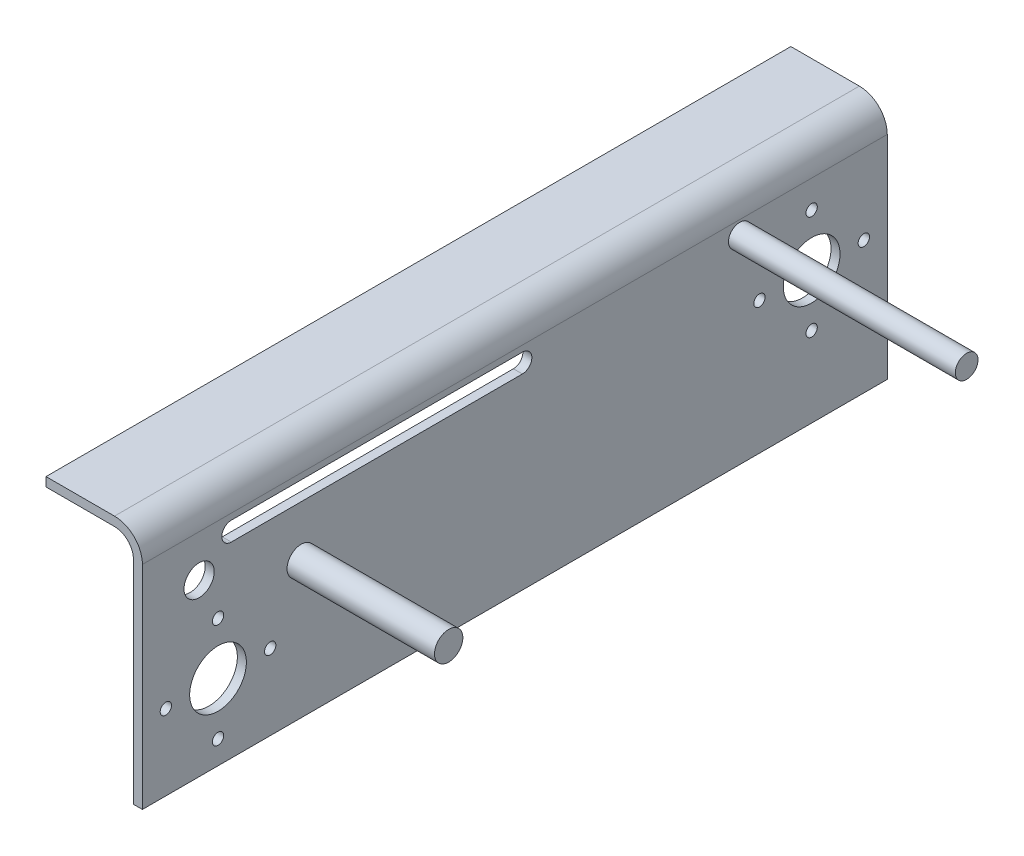
ISO-10303-21;
HEADER;
FILE_DESCRIPTION(('STEP AP214'),'2;1');
FILE_NAME('part.step','',(''),(''),'','','');
FILE_SCHEMA(('AUTOMOTIVE_DESIGN { 1 0 10303 214 1 1 1 1 }'));
ENDSEC;
DATA;
#1=APPLICATION_CONTEXT('core data for automotive mechanical design processes');
#2=APPLICATION_PROTOCOL_DEFINITION('international standard','automotive_design',2000,#1);
#3=PRODUCT_CONTEXT('',#1,'mechanical');
#4=PRODUCT('Part','Part','',(#3));
#5=PRODUCT_RELATED_PRODUCT_CATEGORY('part','',(#4));
#6=PRODUCT_DEFINITION_FORMATION('','',#4);
#7=PRODUCT_DEFINITION_CONTEXT('part definition',#1,'design');
#8=PRODUCT_DEFINITION('design','',#6,#7);
#9=PRODUCT_DEFINITION_SHAPE('','',#8);
#10=(LENGTH_UNIT() NAMED_UNIT(*) SI_UNIT(.MILLI.,.METRE.));
#11=(NAMED_UNIT(*) PLANE_ANGLE_UNIT() SI_UNIT($,.RADIAN.));
#12=(NAMED_UNIT(*) SI_UNIT($,.STERADIAN.) SOLID_ANGLE_UNIT());
#13=UNCERTAINTY_MEASURE_WITH_UNIT(LENGTH_MEASURE(1.E-05),#10,'distance_accuracy_value','');
#14=(GEOMETRIC_REPRESENTATION_CONTEXT(3) GLOBAL_UNCERTAINTY_ASSIGNED_CONTEXT((#13)) GLOBAL_UNIT_ASSIGNED_CONTEXT((#10,
#11,#12)) REPRESENTATION_CONTEXT('',''));
#15=CARTESIAN_POINT('',(0.,0.,0.));
#16=DIRECTION('',(0.,0.,1.));
#17=DIRECTION('',(1.,0.,0.));
#18=AXIS2_PLACEMENT_3D('',#15,#16,#17);
#19=CARTESIAN_POINT('',(96.1646609388252,24.5714715738549,-394.));
#20=DIRECTION('',(-1.,0.,0.));
#21=DIRECTION('',(0.,0.,1.));
#22=AXIS2_PLACEMENT_3D('',#19,#20,#21);
#23=PLANE('',#22);
#24=CARTESIAN_POINT('',(96.1646609388252,128.571471573855,-47.));
#25=DIRECTION('',(-1.,0.,0.));
#26=DIRECTION('',(0.,0.,1.));
#27=AXIS2_PLACEMENT_3D('',#24,#25,#26);
#28=CIRCLE('',#27,5.00000000000003);
#29=CARTESIAN_POINT('',(96.1646609388252,123.571471573855,-47.));
#30=VERTEX_POINT('',#29);
#31=CARTESIAN_POINT('',(96.1646609388252,133.571471573855,-47.));
#32=VERTEX_POINT('',#31);
#33=EDGE_CURVE('E161',#30,#32,#28,.T.);
#34=ORIENTED_EDGE('',*,*,#33,.F.);
#35=DIRECTION('',(0.,0.,1.));
#36=VECTOR('',#35,1.);
#37=CARTESIAN_POINT('',(96.1646609388252,123.571471573855,-394.));
#38=LINE('',#37,#36);
#39=CARTESIAN_POINT('',(96.1646609388252,123.571471573855,-201.));
#40=VERTEX_POINT('',#39);
#41=EDGE_CURVE('E154',#40,#30,#38,.T.);
#42=ORIENTED_EDGE('',*,*,#41,.F.);
#43=CARTESIAN_POINT('',(96.1646609388252,128.571471573855,-201.));
#44=DIRECTION('',(-1.,0.,0.));
#45=DIRECTION('',(0.,0.,1.));
#46=AXIS2_PLACEMENT_3D('',#43,#44,#45);
#47=CIRCLE('',#46,5.00000000000003);
#48=CARTESIAN_POINT('',(96.1646609388252,133.571471573855,-201.));
#49=VERTEX_POINT('',#48);
#50=EDGE_CURVE('E134',#49,#40,#47,.T.);
#51=ORIENTED_EDGE('',*,*,#50,.F.);
#52=DIRECTION('',(0.,0.,-1.));
#53=VECTOR('',#52,1.);
#54=CARTESIAN_POINT('',(96.1646609388252,133.571471573855,-394.));
#55=LINE('',#54,#53);
#56=EDGE_CURVE('E159',#32,#49,#55,.T.);
#57=ORIENTED_EDGE('',*,*,#56,.F.);
#58=EDGE_LOOP('',(#34,#42,#51,#57));
#59=FACE_BOUND('',#58,.T.);
#60=CARTESIAN_POINT('',(96.1646609388252,114.571471573855,-30.));
#61=DIRECTION('',(-1.,0.,0.));
#62=DIRECTION('',(0.,0.,1.));
#63=AXIS2_PLACEMENT_3D('',#60,#61,#62);
#64=CIRCLE('',#63,8.);
#65=CARTESIAN_POINT('',(96.1646609388252,114.571471573855,-22.));
#66=VERTEX_POINT('',#65);
#67=EDGE_CURVE('E178',#66,#66,#64,.T.);
#68=ORIENTED_EDGE('',*,*,#67,.F.);
#69=EDGE_LOOP('',(#68));
#70=FACE_BOUND('',#69,.T.);
#71=CARTESIAN_POINT('',(96.1646609388252,36.9738849847746,-40.0000000000078));
#72=DIRECTION('',(-1.,0.,0.));
#73=DIRECTION('',(0.,0.,-1.));
#74=AXIS2_PLACEMENT_3D('',#71,#72,#73);
#75=CIRCLE('',#74,3.00000000000782);
#76=CARTESIAN_POINT('',(96.1646609388252,36.9738849847746,-43.0000000000156));
#77=VERTEX_POINT('',#76);
#78=EDGE_CURVE('E186',#77,#77,#75,.T.);
#79=ORIENTED_EDGE('',*,*,#78,.F.);
#80=EDGE_LOOP('',(#79));
#81=FACE_BOUND('',#80,.T.);
#82=CARTESIAN_POINT('',(96.1646609388252,64.5714715738549,-40.));
#83=DIRECTION('',(-1.,0.,0.));
#84=DIRECTION('',(0.,0.,-1.));
#85=AXIS2_PLACEMENT_3D('',#82,#83,#84);
#86=CIRCLE('',#85,15.);
#87=CARTESIAN_POINT('',(96.1646609388252,64.5714715738549,-55.0000000000001));
#88=VERTEX_POINT('',#87);
#89=EDGE_CURVE('E200',#88,#88,#86,.T.);
#90=ORIENTED_EDGE('',*,*,#89,.F.);
#91=EDGE_LOOP('',(#90));
#92=FACE_BOUND('',#91,.T.);
#93=CARTESIAN_POINT('',(96.1646609388252,92.1690581629351,-40.));
#94=DIRECTION('',(-1.,0.,0.));
#95=DIRECTION('',(0.,0.,-1.));
#96=AXIS2_PLACEMENT_3D('',#93,#94,#95);
#97=CIRCLE('',#96,2.99999999999994);
#98=CARTESIAN_POINT('',(96.1646609388252,92.1690581629351,-43.));
#99=VERTEX_POINT('',#98);
#100=EDGE_CURVE('E194',#99,#99,#97,.T.);
#101=ORIENTED_EDGE('',*,*,#100,.F.);
#102=EDGE_LOOP('',(#101));
#103=FACE_BOUND('',#102,.T.);
#104=CARTESIAN_POINT('',(96.1646609388252,64.5714715738588,-67.5975865890841));
#105=DIRECTION('',(-1.,0.,0.));
#106=DIRECTION('',(0.,0.,-1.));
#107=AXIS2_PLACEMENT_3D('',#104,#105,#106);
#108=CIRCLE('',#107,3.00000000000261);
#109=CARTESIAN_POINT('',(96.1646609388252,64.5714715738588,-70.5975865890867));
#110=VERTEX_POINT('',#109);
#111=EDGE_CURVE('E193',#110,#110,#108,.T.);
#112=ORIENTED_EDGE('',*,*,#111,.F.);
#113=EDGE_LOOP('',(#112));
#114=FACE_BOUND('',#113,.T.);
#115=CARTESIAN_POINT('',(96.1646609388252,64.5714715738509,-12.4024134109237));
#116=DIRECTION('',(-1.,0.,0.));
#117=DIRECTION('',(0.,0.,-1.));
#118=AXIS2_PLACEMENT_3D('',#115,#116,#117);
#119=CIRCLE('',#118,3.00000000000516);
#120=CARTESIAN_POINT('',(96.1646609388252,64.5714715738509,-15.4024134109289));
#121=VERTEX_POINT('',#120);
#122=EDGE_CURVE('E206',#121,#121,#119,.T.);
#123=ORIENTED_EDGE('',*,*,#122,.F.);
#124=EDGE_LOOP('',(#123));
#125=FACE_BOUND('',#124,.T.);
#126=CARTESIAN_POINT('',(96.1646609388252,94.5714715738588,-381.597586589085));
#127=DIRECTION('',(-1.,0.,0.));
#128=DIRECTION('',(0.,0.,-1.));
#129=AXIS2_PLACEMENT_3D('',#126,#127,#128);
#130=CIRCLE('',#129,3.00000000000249);
#131=CARTESIAN_POINT('',(96.1646609388252,94.5714715738588,-384.597586589087));
#132=VERTEX_POINT('',#131);
#133=EDGE_CURVE('E224',#132,#132,#130,.T.);
#134=ORIENTED_EDGE('',*,*,#133,.F.);
#135=EDGE_LOOP('',(#134));
#136=FACE_BOUND('',#135,.T.);
#137=CARTESIAN_POINT('',(96.1646609388252,94.5714715738549,-354.));
#138=DIRECTION('',(-1.,0.,0.));
#139=DIRECTION('',(0.,0.,-1.));
#140=AXIS2_PLACEMENT_3D('',#137,#138,#139);
#141=CIRCLE('',#140,15.0000000000001);
#142=CARTESIAN_POINT('',(96.1646609388252,94.5714715738549,-369.));
#143=VERTEX_POINT('',#142);
#144=EDGE_CURVE('E218',#143,#143,#141,.T.);
#145=ORIENTED_EDGE('',*,*,#144,.F.);
#146=EDGE_LOOP('',(#145));
#147=FACE_BOUND('',#146,.T.);
#148=CARTESIAN_POINT('',(96.1646609388252,66.9738849847746,-354.000000000008));
#149=DIRECTION('',(-1.,0.,0.));
#150=DIRECTION('',(0.,0.,-1.));
#151=AXIS2_PLACEMENT_3D('',#148,#149,#150);
#152=CIRCLE('',#151,3.00000000000783);
#153=CARTESIAN_POINT('',(96.1646609388252,66.9738849847746,-357.000000000016));
#154=VERTEX_POINT('',#153);
#155=EDGE_CURVE('E217',#154,#154,#152,.T.);
#156=ORIENTED_EDGE('',*,*,#155,.F.);
#157=EDGE_LOOP('',(#156));
#158=FACE_BOUND('',#157,.T.);
#159=CARTESIAN_POINT('',(96.1646609388252,94.571471573851,-326.402413410924));
#160=DIRECTION('',(-1.,0.,0.));
#161=DIRECTION('',(0.,0.,-1.));
#162=AXIS2_PLACEMENT_3D('',#159,#160,#161);
#163=CIRCLE('',#162,3.00000000000528);
#164=CARTESIAN_POINT('',(96.1646609388252,94.571471573851,-329.402413410929));
#165=VERTEX_POINT('',#164);
#166=EDGE_CURVE('E230',#165,#165,#163,.T.);
#167=ORIENTED_EDGE('',*,*,#166,.F.);
#168=EDGE_LOOP('',(#167));
#169=FACE_BOUND('',#168,.T.);
#170=CARTESIAN_POINT('',(96.1646609388252,122.169058162935,-354.));
#171=DIRECTION('',(-1.,0.,0.));
#172=DIRECTION('',(0.,0.,-1.));
#173=AXIS2_PLACEMENT_3D('',#170,#171,#172);
#174=CIRCLE('',#173,2.99999999999994);
#175=CARTESIAN_POINT('',(96.1646609388252,122.169058162935,-357.));
#176=VERTEX_POINT('',#175);
#177=EDGE_CURVE('E181',#176,#176,#174,.T.);
#178=ORIENTED_EDGE('',*,*,#177,.F.);
#179=EDGE_LOOP('',(#178));
#180=FACE_BOUND('',#179,.T.);
#181=DIRECTION('',(0.,-1.,0.));
#182=VECTOR('',#181,1.);
#183=CARTESIAN_POINT('',(96.1646609388252,24.5714715738549,0.));
#184=LINE('',#183,#182);
#185=CARTESIAN_POINT('',(96.1646609388252,136.808971573855,0.));
#186=VERTEX_POINT('',#185);
#187=CARTESIAN_POINT('',(96.1646609388252,24.5714715738549,0.));
#188=VERTEX_POINT('',#187);
#189=EDGE_CURVE('E185',#186,#188,#184,.T.);
#190=ORIENTED_EDGE('',*,*,#189,.F.);
#191=DIRECTION('',(0.,0.,1.));
#192=VECTOR('',#191,1.);
#193=CARTESIAN_POINT('',(96.1646609388252,136.808971573855,-394.));
#194=LINE('',#193,#192);
#195=CARTESIAN_POINT('',(96.1646609388252,136.808971573855,-394.));
#196=VERTEX_POINT('',#195);
#197=EDGE_CURVE('E11',#196,#186,#194,.T.);
#198=ORIENTED_EDGE('',*,*,#197,.F.);
#199=DIRECTION('',(0.,-1.,0.));
#200=VECTOR('',#199,1.);
#201=CARTESIAN_POINT('',(96.1646609388252,24.5714715738549,-394.));
#202=LINE('',#201,#200);
#203=CARTESIAN_POINT('',(96.1646609388252,24.5714715738549,-394.));
#204=VERTEX_POINT('',#203);
#205=EDGE_CURVE('E242',#196,#204,#202,.T.);
#206=ORIENTED_EDGE('',*,*,#205,.T.);
#207=DIRECTION('',(0.,0.,1.));
#208=VECTOR('',#207,1.);
#209=CARTESIAN_POINT('',(96.1646609388252,24.5714715738549,-394.));
#210=LINE('',#209,#208);
#211=EDGE_CURVE('E42',#204,#188,#210,.T.);
#212=ORIENTED_EDGE('',*,*,#211,.T.);
#213=EDGE_LOOP('',(#190,#198,#206,#212));
#214=FACE_BOUND('',#213,.T.);
#215=ADVANCED_FACE('F39',(#59,#70,#81,#92,#103,#114,#125,#136,#147,#158,#169,#180,#214),#23,.T.);
#216=CARTESIAN_POINT('',(86.1646609388252,136.808971573855,-394.));
#217=DIRECTION('',(0.,0.,1.));
#218=DIRECTION('',(1.,0.,0.));
#219=AXIS2_PLACEMENT_3D('',#216,#217,#218);
#220=CYLINDRICAL_SURFACE('',#219,9.99999999999999);
#221=CARTESIAN_POINT('',(86.1646609388252,136.808971573855,0.));
#222=DIRECTION('',(0.,0.,-1.));
#223=DIRECTION('',(-1.,0.,0.));
#224=AXIS2_PLACEMENT_3D('',#221,#222,#223);
#225=CIRCLE('',#224,9.99999999999999);
#226=CARTESIAN_POINT('',(86.1646609388253,146.808971573855,0.));
#227=VERTEX_POINT('',#226);
#228=EDGE_CURVE('E246',#227,#186,#225,.T.);
#229=ORIENTED_EDGE('',*,*,#228,.F.);
#230=DIRECTION('',(0.,0.,1.));
#231=VECTOR('',#230,1.);
#232=CARTESIAN_POINT('',(86.1646609388253,146.808971573855,-394.));
#233=LINE('',#232,#231);
#234=CARTESIAN_POINT('',(86.1646609388253,146.808971573855,-394.));
#235=VERTEX_POINT('',#234);
#236=EDGE_CURVE('E47',#235,#227,#233,.T.);
#237=ORIENTED_EDGE('',*,*,#236,.F.);
#238=CARTESIAN_POINT('',(86.1646609388252,136.808971573855,-394.));
#239=DIRECTION('',(0.,0.,-1.));
#240=DIRECTION('',(-1.,0.,0.));
#241=AXIS2_PLACEMENT_3D('',#238,#239,#240);
#242=CIRCLE('',#241,9.99999999999999);
#243=EDGE_CURVE('E264',#235,#196,#242,.T.);
#244=ORIENTED_EDGE('',*,*,#243,.T.);
#245=ORIENTED_EDGE('',*,*,#197,.T.);
#246=EDGE_LOOP('',(#229,#237,#244,#245));
#247=FACE_BOUND('',#246,.T.);
#248=ADVANCED_FACE('F311',(#247),#220,.F.);
#249=CARTESIAN_POINT('',(49.9271609388252,146.808971573855,-394.));
#250=DIRECTION('',(0.,-1.,0.));
#251=DIRECTION('',(1.,0.,0.));
#252=AXIS2_PLACEMENT_3D('',#249,#250,#251);
#253=PLANE('',#252);
#254=DIRECTION('',(1.,0.,0.));
#255=VECTOR('',#254,1.);
#256=CARTESIAN_POINT('',(49.9271609388252,146.808971573855,0.));
#257=LINE('',#256,#255);
#258=CARTESIAN_POINT('',(49.9271609388252,146.808971573855,0.));
#259=VERTEX_POINT('',#258);
#260=EDGE_CURVE('E284',#259,#227,#257,.T.);
#261=ORIENTED_EDGE('',*,*,#260,.F.);
#262=DIRECTION('',(0.,0.,1.));
#263=VECTOR('',#262,1.);
#264=CARTESIAN_POINT('',(49.9271609388252,146.808971573855,-394.));
#265=LINE('',#264,#263);
#266=CARTESIAN_POINT('',(49.9271609388252,146.808971573855,-394.));
#267=VERTEX_POINT('',#266);
#268=EDGE_CURVE('E290',#267,#259,#265,.T.);
#269=ORIENTED_EDGE('',*,*,#268,.F.);
#270=DIRECTION('',(1.,0.,0.));
#271=VECTOR('',#270,1.);
#272=CARTESIAN_POINT('',(49.9271609388252,146.808971573855,-394.));
#273=LINE('',#272,#271);
#274=EDGE_CURVE('E261',#267,#235,#273,.T.);
#275=ORIENTED_EDGE('',*,*,#274,.T.);
#276=ORIENTED_EDGE('',*,*,#236,.T.);
#277=EDGE_LOOP('',(#261,#269,#275,#276));
#278=FACE_BOUND('',#277,.T.);
#279=ADVANCED_FACE('F331',(#278),#253,.T.);
#280=CARTESIAN_POINT('',(49.9271609388252,146.808971573855,-394.));
#281=DIRECTION('',(-1.,0.,0.));
#282=DIRECTION('',(0.,-1.,0.));
#283=AXIS2_PLACEMENT_3D('',#280,#281,#282);
#284=PLANE('',#283);
#285=DIRECTION('',(0.,-1.,0.));
#286=VECTOR('',#285,1.);
#287=CARTESIAN_POINT('',(49.9271609388252,146.808971573855,0.));
#288=LINE('',#287,#286);
#289=CARTESIAN_POINT('',(49.9271609388252,151.571471573855,0.));
#290=VERTEX_POINT('',#289);
#291=EDGE_CURVE('E281',#290,#259,#288,.T.);
#292=ORIENTED_EDGE('',*,*,#291,.F.);
#293=DIRECTION('',(0.,0.,1.));
#294=VECTOR('',#293,1.);
#295=CARTESIAN_POINT('',(49.9271609388252,151.571471573855,-394.));
#296=LINE('',#295,#294);
#297=CARTESIAN_POINT('',(49.9271609388252,151.571471573855,-394.));
#298=VERTEX_POINT('',#297);
#299=EDGE_CURVE('E292',#298,#290,#296,.T.);
#300=ORIENTED_EDGE('',*,*,#299,.F.);
#301=DIRECTION('',(0.,-1.,0.));
#302=VECTOR('',#301,1.);
#303=CARTESIAN_POINT('',(49.9271609388252,146.808971573855,-394.));
#304=LINE('',#303,#302);
#305=EDGE_CURVE('E258',#298,#267,#304,.T.);
#306=ORIENTED_EDGE('',*,*,#305,.T.);
#307=ORIENTED_EDGE('',*,*,#268,.T.);
#308=EDGE_LOOP('',(#292,#300,#306,#307));
#309=FACE_BOUND('',#308,.T.);
#310=ADVANCED_FACE('F329',(#309),#284,.T.);
#311=CARTESIAN_POINT('',(49.9271609388252,151.571471573855,-394.));
#312=DIRECTION('',(0.,1.,0.));
#313=DIRECTION('',(-1.,0.,0.));
#314=AXIS2_PLACEMENT_3D('',#311,#312,#313);
#315=PLANE('',#314);
#316=DIRECTION('',(-1.,0.,0.));
#317=VECTOR('',#316,1.);
#318=CARTESIAN_POINT('',(49.9271609388252,151.571471573855,0.));
#319=LINE('',#318,#317);
#320=CARTESIAN_POINT('',(86.1646609388253,151.571471573855,0.));
#321=VERTEX_POINT('',#320);
#322=EDGE_CURVE('E278',#321,#290,#319,.T.);
#323=ORIENTED_EDGE('',*,*,#322,.F.);
#324=DIRECTION('',(0.,0.,1.));
#325=VECTOR('',#324,1.);
#326=CARTESIAN_POINT('',(86.1646609388253,151.571471573855,-394.));
#327=LINE('',#326,#325);
#328=CARTESIAN_POINT('',(86.1646609388253,151.571471573855,-394.));
#329=VERTEX_POINT('',#328);
#330=EDGE_CURVE('E294',#329,#321,#327,.T.);
#331=ORIENTED_EDGE('',*,*,#330,.F.);
#332=DIRECTION('',(-1.,0.,0.));
#333=VECTOR('',#332,1.);
#334=CARTESIAN_POINT('',(49.9271609388252,151.571471573855,-394.));
#335=LINE('',#334,#333);
#336=EDGE_CURVE('E255',#329,#298,#335,.T.);
#337=ORIENTED_EDGE('',*,*,#336,.T.);
#338=ORIENTED_EDGE('',*,*,#299,.T.);
#339=EDGE_LOOP('',(#323,#331,#337,#338));
#340=FACE_BOUND('',#339,.T.);
#341=ADVANCED_FACE('F325',(#340),#315,.T.);
#342=CARTESIAN_POINT('',(86.1646609388252,136.808971573855,-394.));
#343=DIRECTION('',(0.,0.,1.));
#344=DIRECTION('',(1.,0.,0.));
#345=AXIS2_PLACEMENT_3D('',#342,#343,#344);
#346=CYLINDRICAL_SURFACE('',#345,14.7625);
#347=CARTESIAN_POINT('',(86.1646609388252,136.808971573855,0.));
#348=DIRECTION('',(0.,0.,1.));
#349=DIRECTION('',(-1.,0.,0.));
#350=AXIS2_PLACEMENT_3D('',#347,#348,#349);
#351=CIRCLE('',#350,14.7625);
#352=CARTESIAN_POINT('',(100.927160938825,136.808971573855,0.));
#353=VERTEX_POINT('',#352);
#354=EDGE_CURVE('E275',#353,#321,#351,.T.);
#355=ORIENTED_EDGE('',*,*,#354,.F.);
#356=DIRECTION('',(0.,0.,1.));
#357=VECTOR('',#356,1.);
#358=CARTESIAN_POINT('',(100.927160938825,136.808971573855,-394.));
#359=LINE('',#358,#357);
#360=CARTESIAN_POINT('',(100.927160938825,136.808971573855,-394.));
#361=VERTEX_POINT('',#360);
#362=EDGE_CURVE('E296',#361,#353,#359,.T.);
#363=ORIENTED_EDGE('',*,*,#362,.F.);
#364=CARTESIAN_POINT('',(86.1646609388252,136.808971573855,-394.));
#365=DIRECTION('',(0.,0.,1.));
#366=DIRECTION('',(-1.,0.,0.));
#367=AXIS2_PLACEMENT_3D('',#364,#365,#366);
#368=CIRCLE('',#367,14.7625);
#369=EDGE_CURVE('E252',#361,#329,#368,.T.);
#370=ORIENTED_EDGE('',*,*,#369,.T.);
#371=ORIENTED_EDGE('',*,*,#330,.T.);
#372=EDGE_LOOP('',(#355,#363,#370,#371));
#373=FACE_BOUND('',#372,.T.);
#374=ADVANCED_FACE('F323',(#373),#346,.T.);
#375=CARTESIAN_POINT('',(100.927160938825,24.5714715738549,-394.));
#376=DIRECTION('',(1.,0.,0.));
#377=DIRECTION('',(0.,1.,0.));
#378=AXIS2_PLACEMENT_3D('',#375,#376,#377);
#379=PLANE('',#378);
#380=CARTESIAN_POINT('',(100.927160938825,128.571471573855,-47.));
#381=DIRECTION('',(1.,0.,0.));
#382=DIRECTION('',(0.,1.,0.));
#383=AXIS2_PLACEMENT_3D('',#380,#381,#382);
#384=CIRCLE('',#383,5.00000000000003);
#385=CARTESIAN_POINT('',(100.927160938825,133.571471573855,-47.));
#386=VERTEX_POINT('',#385);
#387=CARTESIAN_POINT('',(100.927160938825,123.571471573855,-47.));
#388=VERTEX_POINT('',#387);
#389=EDGE_CURVE('E63',#386,#388,#384,.T.);
#390=ORIENTED_EDGE('',*,*,#389,.F.);
#391=DIRECTION('',(0.,0.,1.));
#392=VECTOR('',#391,1.);
#393=CARTESIAN_POINT('',(100.927160938825,133.571471573855,-47.));
#394=LINE('',#393,#392);
#395=CARTESIAN_POINT('',(100.927160938825,133.571471573855,-201.));
#396=VERTEX_POINT('',#395);
#397=EDGE_CURVE('E147',#396,#386,#394,.T.);
#398=ORIENTED_EDGE('',*,*,#397,.F.);
#399=CARTESIAN_POINT('',(100.927160938825,128.571471573855,-201.));
#400=DIRECTION('',(1.,0.,0.));
#401=DIRECTION('',(0.,1.,0.));
#402=AXIS2_PLACEMENT_3D('',#399,#400,#401);
#403=CIRCLE('',#402,5.00000000000003);
#404=CARTESIAN_POINT('',(100.927160938825,123.571471573855,-201.));
#405=VERTEX_POINT('',#404);
#406=EDGE_CURVE('E131',#405,#396,#403,.T.);
#407=ORIENTED_EDGE('',*,*,#406,.F.);
#408=DIRECTION('',(0.,0.,-1.));
#409=VECTOR('',#408,1.);
#410=CARTESIAN_POINT('',(100.927160938825,123.571471573855,-47.));
#411=LINE('',#410,#409);
#412=EDGE_CURVE('E140',#388,#405,#411,.T.);
#413=ORIENTED_EDGE('',*,*,#412,.F.);
#414=EDGE_LOOP('',(#390,#398,#407,#413));
#415=FACE_BOUND('',#414,.T.);
#416=CARTESIAN_POINT('',(100.927160938825,129.571471573855,-316.));
#417=DIRECTION('',(1.,0.,0.));
#418=DIRECTION('',(0.,1.,0.));
#419=AXIS2_PLACEMENT_3D('',#416,#417,#418);
#420=CIRCLE('',#419,5.99999999999999);
#421=CARTESIAN_POINT('',(100.927160938825,135.571471573855,-316.));
#422=VERTEX_POINT('',#421);
#423=EDGE_CURVE('E163',#422,#422,#420,.T.);
#424=ORIENTED_EDGE('',*,*,#423,.F.);
#425=EDGE_LOOP('',(#424));
#426=FACE_BOUND('',#425,.T.);
#427=CARTESIAN_POINT('',(100.927160938825,96.5714715738549,-84.));
#428=DIRECTION('',(1.,0.,0.));
#429=DIRECTION('',(0.,1.,0.));
#430=AXIS2_PLACEMENT_3D('',#427,#428,#429);
#431=CIRCLE('',#430,7.50000000000003);
#432=CARTESIAN_POINT('',(100.927160938825,104.071471573855,-84.));
#433=VERTEX_POINT('',#432);
#434=EDGE_CURVE('E167',#433,#433,#431,.T.);
#435=ORIENTED_EDGE('',*,*,#434,.F.);
#436=EDGE_LOOP('',(#435));
#437=FACE_BOUND('',#436,.T.);
#438=CARTESIAN_POINT('',(100.927160938825,114.571471573855,-30.));
#439=DIRECTION('',(1.,0.,0.));
#440=DIRECTION('',(0.,1.,0.));
#441=AXIS2_PLACEMENT_3D('',#438,#439,#440);
#442=CIRCLE('',#441,8.);
#443=CARTESIAN_POINT('',(100.927160938825,122.571471573855,-30.));
#444=VERTEX_POINT('',#443);
#445=EDGE_CURVE('E173',#444,#444,#442,.T.);
#446=ORIENTED_EDGE('',*,*,#445,.F.);
#447=EDGE_LOOP('',(#446));
#448=FACE_BOUND('',#447,.T.);
#449=CARTESIAN_POINT('',(100.927160938825,36.9738849847746,-40.0000000000078));
#450=DIRECTION('',(-1.,0.,0.));
#451=DIRECTION('',(0.,0.,-1.));
#452=AXIS2_PLACEMENT_3D('',#449,#450,#451);
#453=CIRCLE('',#452,3.00000000000782);
#454=CARTESIAN_POINT('',(100.927160938825,36.9738849847746,-43.0000000000156));
#455=VERTEX_POINT('',#454);
#456=EDGE_CURVE('E182',#455,#455,#453,.T.);
#457=ORIENTED_EDGE('',*,*,#456,.T.);
#458=EDGE_LOOP('',(#457));
#459=FACE_BOUND('',#458,.T.);
#460=CARTESIAN_POINT('',(100.927160938825,64.5714715738549,-40.));
#461=DIRECTION('',(-1.,0.,0.));
#462=DIRECTION('',(0.,0.,-1.));
#463=AXIS2_PLACEMENT_3D('',#460,#461,#462);
#464=CIRCLE('',#463,15.);
#465=CARTESIAN_POINT('',(100.927160938825,64.5714715738549,-55.0000000000001));
#466=VERTEX_POINT('',#465);
#467=EDGE_CURVE('E197',#466,#466,#464,.T.);
#468=ORIENTED_EDGE('',*,*,#467,.T.);
#469=EDGE_LOOP('',(#468));
#470=FACE_BOUND('',#469,.T.);
#471=CARTESIAN_POINT('',(100.927160938825,92.1690581629351,-40.));
#472=DIRECTION('',(-1.,0.,0.));
#473=DIRECTION('',(0.,0.,-1.));
#474=AXIS2_PLACEMENT_3D('',#471,#472,#473);
#475=CIRCLE('',#474,2.99999999999994);
#476=CARTESIAN_POINT('',(100.927160938825,92.1690581629351,-43.));
#477=VERTEX_POINT('',#476);
#478=EDGE_CURVE('E190',#477,#477,#475,.T.);
#479=ORIENTED_EDGE('',*,*,#478,.T.);
#480=EDGE_LOOP('',(#479));
#481=FACE_BOUND('',#480,.T.);
#482=CARTESIAN_POINT('',(100.927160938825,64.5714715738588,-67.5975865890841));
#483=DIRECTION('',(-1.,0.,0.));
#484=DIRECTION('',(0.,0.,-1.));
#485=AXIS2_PLACEMENT_3D('',#482,#483,#484);
#486=CIRCLE('',#485,3.00000000000261);
#487=CARTESIAN_POINT('',(100.927160938825,64.5714715738588,-70.5975865890867));
#488=VERTEX_POINT('',#487);
#489=EDGE_CURVE('E209',#488,#488,#486,.T.);
#490=ORIENTED_EDGE('',*,*,#489,.T.);
#491=EDGE_LOOP('',(#490));
#492=FACE_BOUND('',#491,.T.);
#493=CARTESIAN_POINT('',(100.927160938825,64.5714715738509,-12.4024134109237));
#494=DIRECTION('',(-1.,0.,0.));
#495=DIRECTION('',(0.,0.,-1.));
#496=AXIS2_PLACEMENT_3D('',#493,#494,#495);
#497=CIRCLE('',#496,3.00000000000516);
#498=CARTESIAN_POINT('',(100.927160938825,64.5714715738509,-15.4024134109289));
#499=VERTEX_POINT('',#498);
#500=EDGE_CURVE('E189',#499,#499,#497,.T.);
#501=ORIENTED_EDGE('',*,*,#500,.T.);
#502=EDGE_LOOP('',(#501));
#503=FACE_BOUND('',#502,.T.);
#504=CARTESIAN_POINT('',(100.927160938825,94.5714715738588,-381.597586589085));
#505=DIRECTION('',(-1.,0.,0.));
#506=DIRECTION('',(0.,0.,-1.));
#507=AXIS2_PLACEMENT_3D('',#504,#505,#506);
#508=CIRCLE('',#507,3.00000000000249);
#509=CARTESIAN_POINT('',(100.927160938825,94.5714715738588,-384.597586589087));
#510=VERTEX_POINT('',#509);
#511=EDGE_CURVE('E221',#510,#510,#508,.T.);
#512=ORIENTED_EDGE('',*,*,#511,.T.);
#513=EDGE_LOOP('',(#512));
#514=FACE_BOUND('',#513,.T.);
#515=CARTESIAN_POINT('',(100.927160938825,94.5714715738549,-354.));
#516=DIRECTION('',(-1.,0.,0.));
#517=DIRECTION('',(0.,0.,-1.));
#518=AXIS2_PLACEMENT_3D('',#515,#516,#517);
#519=CIRCLE('',#518,15.0000000000001);
#520=CARTESIAN_POINT('',(100.927160938825,94.5714715738549,-369.));
#521=VERTEX_POINT('',#520);
#522=EDGE_CURVE('E214',#521,#521,#519,.T.);
#523=ORIENTED_EDGE('',*,*,#522,.T.);
#524=EDGE_LOOP('',(#523));
#525=FACE_BOUND('',#524,.T.);
#526=CARTESIAN_POINT('',(100.927160938825,66.9738849847746,-354.000000000008));
#527=DIRECTION('',(-1.,0.,0.));
#528=DIRECTION('',(0.,0.,-1.));
#529=AXIS2_PLACEMENT_3D('',#526,#527,#528);
#530=CIRCLE('',#529,3.00000000000783);
#531=CARTESIAN_POINT('',(100.927160938825,66.9738849847746,-357.000000000016));
#532=VERTEX_POINT('',#531);
#533=EDGE_CURVE('E233',#532,#532,#530,.T.);
#534=ORIENTED_EDGE('',*,*,#533,.T.);
#535=EDGE_LOOP('',(#534));
#536=FACE_BOUND('',#535,.T.);
#537=CARTESIAN_POINT('',(100.927160938825,94.571471573851,-326.402413410924));
#538=DIRECTION('',(-1.,0.,0.));
#539=DIRECTION('',(0.,0.,-1.));
#540=AXIS2_PLACEMENT_3D('',#537,#538,#539);
#541=CIRCLE('',#540,3.00000000000528);
#542=CARTESIAN_POINT('',(100.927160938825,94.571471573851,-329.402413410929));
#543=VERTEX_POINT('',#542);
#544=EDGE_CURVE('E203',#543,#543,#541,.T.);
#545=ORIENTED_EDGE('',*,*,#544,.T.);
#546=EDGE_LOOP('',(#545));
#547=FACE_BOUND('',#546,.T.);
#548=CARTESIAN_POINT('',(100.927160938825,122.169058162935,-354.));
#549=DIRECTION('',(-1.,0.,0.));
#550=DIRECTION('',(0.,0.,-1.));
#551=AXIS2_PLACEMENT_3D('',#548,#549,#550);
#552=CIRCLE('',#551,2.99999999999994);
#553=CARTESIAN_POINT('',(100.927160938825,122.169058162935,-357.));
#554=VERTEX_POINT('',#553);
#555=EDGE_CURVE('E227',#554,#554,#552,.T.);
#556=ORIENTED_EDGE('',*,*,#555,.T.);
#557=EDGE_LOOP('',(#556));
#558=FACE_BOUND('',#557,.T.);
#559=DIRECTION('',(0.,1.,0.));
#560=VECTOR('',#559,1.);
#561=CARTESIAN_POINT('',(100.927160938825,24.5714715738549,0.));
#562=LINE('',#561,#560);
#563=CARTESIAN_POINT('',(100.927160938825,24.5714715738549,0.));
#564=VERTEX_POINT('',#563);
#565=EDGE_CURVE('E272',#564,#353,#562,.T.);
#566=ORIENTED_EDGE('',*,*,#565,.F.);
#567=DIRECTION('',(0.,0.,1.));
#568=VECTOR('',#567,1.);
#569=CARTESIAN_POINT('',(100.927160938825,24.5714715738549,-394.));
#570=LINE('',#569,#568);
#571=CARTESIAN_POINT('',(100.927160938825,24.5714715738549,-394.));
#572=VERTEX_POINT('',#571);
#573=EDGE_CURVE('E297',#572,#564,#570,.T.);
#574=ORIENTED_EDGE('',*,*,#573,.F.);
#575=DIRECTION('',(0.,1.,0.));
#576=VECTOR('',#575,1.);
#577=CARTESIAN_POINT('',(100.927160938825,24.5714715738549,-394.));
#578=LINE('',#577,#576);
#579=EDGE_CURVE('E249',#572,#361,#578,.T.);
#580=ORIENTED_EDGE('',*,*,#579,.T.);
#581=ORIENTED_EDGE('',*,*,#362,.T.);
#582=EDGE_LOOP('',(#566,#574,#580,#581));
#583=FACE_BOUND('',#582,.T.);
#584=ADVANCED_FACE('F144',(#415,#426,#437,#448,#459,#470,#481,#492,#503,#514,#525,#536,#547,
#558,#583),#379,.T.);
#585=CARTESIAN_POINT('',(96.1646609388252,24.5714715738549,-394.));
#586=DIRECTION('',(0.,-1.,0.));
#587=DIRECTION('',(0.,0.,-1.));
#588=AXIS2_PLACEMENT_3D('',#585,#586,#587);
#589=PLANE('',#588);
#590=DIRECTION('',(1.,0.,0.));
#591=VECTOR('',#590,1.);
#592=CARTESIAN_POINT('',(96.1646609388252,24.5714715738549,0.));
#593=LINE('',#592,#591);
#594=EDGE_CURVE('E269',#188,#564,#593,.T.);
#595=ORIENTED_EDGE('',*,*,#594,.F.);
#596=ORIENTED_EDGE('',*,*,#211,.F.);
#597=DIRECTION('',(1.,0.,0.));
#598=VECTOR('',#597,1.);
#599=CARTESIAN_POINT('',(96.1646609388252,24.5714715738549,-394.));
#600=LINE('',#599,#598);
#601=EDGE_CURVE('E245',#204,#572,#600,.T.);
#602=ORIENTED_EDGE('',*,*,#601,.T.);
#603=ORIENTED_EDGE('',*,*,#573,.T.);
#604=EDGE_LOOP('',(#595,#596,#602,#603));
#605=FACE_BOUND('',#604,.T.);
#606=ADVANCED_FACE('F305',(#605),#589,.T.);
#607=CARTESIAN_POINT('',(86.1646609388252,136.808971573855,-394.));
#608=DIRECTION('',(0.,0.,-1.));
#609=DIRECTION('',(-1.,0.,0.));
#610=AXIS2_PLACEMENT_3D('',#607,#608,#609);
#611=PLANE('',#610);
#612=ORIENTED_EDGE('',*,*,#205,.F.);
#613=ORIENTED_EDGE('',*,*,#243,.F.);
#614=ORIENTED_EDGE('',*,*,#274,.F.);
#615=ORIENTED_EDGE('',*,*,#305,.F.);
#616=ORIENTED_EDGE('',*,*,#336,.F.);
#617=ORIENTED_EDGE('',*,*,#369,.F.);
#618=ORIENTED_EDGE('',*,*,#579,.F.);
#619=ORIENTED_EDGE('',*,*,#601,.F.);
#620=EDGE_LOOP('',(#612,#613,#614,#615,#616,#617,#618,#619));
#621=FACE_BOUND('',#620,.T.);
#622=ADVANCED_FACE('F314',(#621),#611,.T.);
#623=CARTESIAN_POINT('',(86.1646609388252,136.808971573855,0.));
#624=DIRECTION('',(0.,0.,-1.));
#625=DIRECTION('',(-1.,0.,0.));
#626=AXIS2_PLACEMENT_3D('',#623,#624,#625);
#627=PLANE('',#626);
#628=ORIENTED_EDGE('',*,*,#189,.T.);
#629=ORIENTED_EDGE('',*,*,#594,.T.);
#630=ORIENTED_EDGE('',*,*,#565,.T.);
#631=ORIENTED_EDGE('',*,*,#354,.T.);
#632=ORIENTED_EDGE('',*,*,#322,.T.);
#633=ORIENTED_EDGE('',*,*,#291,.T.);
#634=ORIENTED_EDGE('',*,*,#260,.T.);
#635=ORIENTED_EDGE('',*,*,#228,.T.);
#636=EDGE_LOOP('',(#628,#629,#630,#631,#632,#633,#634,#635));
#637=FACE_BOUND('',#636,.T.);
#638=ADVANCED_FACE('F307',(#637),#627,.F.);
#639=CARTESIAN_POINT('',(100.927160938825,122.169058162935,-354.));
#640=DIRECTION('',(-1.,0.,0.));
#641=DIRECTION('',(0.,0.,1.));
#642=AXIS2_PLACEMENT_3D('',#639,#640,#641);
#643=CYLINDRICAL_SURFACE('',#642,2.99999999999994);
#644=ORIENTED_EDGE('',*,*,#555,.F.);
#645=EDGE_LOOP('',(#644));
#646=FACE_BOUND('',#645,.T.);
#647=ORIENTED_EDGE('',*,*,#177,.T.);
#648=EDGE_LOOP('',(#647));
#649=FACE_BOUND('',#648,.T.);
#650=ADVANCED_FACE('F369',(#646,#649),#643,.F.);
#651=CARTESIAN_POINT('',(100.927160938825,94.571471573851,-326.402413410924));
#652=DIRECTION('',(-1.,0.,0.));
#653=DIRECTION('',(0.,0.,1.));
#654=AXIS2_PLACEMENT_3D('',#651,#652,#653);
#655=CYLINDRICAL_SURFACE('',#654,3.00000000000528);
#656=ORIENTED_EDGE('',*,*,#544,.F.);
#657=EDGE_LOOP('',(#656));
#658=FACE_BOUND('',#657,.T.);
#659=ORIENTED_EDGE('',*,*,#166,.T.);
#660=EDGE_LOOP('',(#659));
#661=FACE_BOUND('',#660,.T.);
#662=ADVANCED_FACE('F371',(#658,#661),#655,.F.);
#663=CARTESIAN_POINT('',(100.927160938825,66.9738849847746,-354.000000000008));
#664=DIRECTION('',(-1.,0.,0.));
#665=DIRECTION('',(0.,0.,1.));
#666=AXIS2_PLACEMENT_3D('',#663,#664,#665);
#667=CYLINDRICAL_SURFACE('',#666,3.00000000000783);
#668=ORIENTED_EDGE('',*,*,#533,.F.);
#669=EDGE_LOOP('',(#668));
#670=FACE_BOUND('',#669,.T.);
#671=ORIENTED_EDGE('',*,*,#155,.T.);
#672=EDGE_LOOP('',(#671));
#673=FACE_BOUND('',#672,.T.);
#674=ADVANCED_FACE('F378',(#670,#673),#667,.F.);
#675=CARTESIAN_POINT('',(100.927160938825,94.5714715738549,-354.));
#676=DIRECTION('',(-1.,0.,0.));
#677=DIRECTION('',(0.,0.,1.));
#678=AXIS2_PLACEMENT_3D('',#675,#676,#677);
#679=CYLINDRICAL_SURFACE('',#678,15.0000000000001);
#680=ORIENTED_EDGE('',*,*,#522,.F.);
#681=EDGE_LOOP('',(#680));
#682=FACE_BOUND('',#681,.T.);
#683=ORIENTED_EDGE('',*,*,#144,.T.);
#684=EDGE_LOOP('',(#683));
#685=FACE_BOUND('',#684,.T.);
#686=ADVANCED_FACE('F495',(#682,#685),#679,.F.);
#687=CARTESIAN_POINT('',(100.927160938825,94.5714715738588,-381.597586589085));
#688=DIRECTION('',(-1.,0.,0.));
#689=DIRECTION('',(0.,0.,1.));
#690=AXIS2_PLACEMENT_3D('',#687,#688,#689);
#691=CYLINDRICAL_SURFACE('',#690,3.00000000000249);
#692=ORIENTED_EDGE('',*,*,#511,.F.);
#693=EDGE_LOOP('',(#692));
#694=FACE_BOUND('',#693,.T.);
#695=ORIENTED_EDGE('',*,*,#133,.T.);
#696=EDGE_LOOP('',(#695));
#697=FACE_BOUND('',#696,.T.);
#698=ADVANCED_FACE('F490',(#694,#697),#691,.F.);
#699=CARTESIAN_POINT('',(100.927160938825,64.5714715738509,-12.4024134109237));
#700=DIRECTION('',(-1.,0.,0.));
#701=DIRECTION('',(0.,0.,1.));
#702=AXIS2_PLACEMENT_3D('',#699,#700,#701);
#703=CYLINDRICAL_SURFACE('',#702,3.00000000000516);
#704=ORIENTED_EDGE('',*,*,#500,.F.);
#705=EDGE_LOOP('',(#704));
#706=FACE_BOUND('',#705,.T.);
#707=ORIENTED_EDGE('',*,*,#122,.T.);
#708=EDGE_LOOP('',(#707));
#709=FACE_BOUND('',#708,.T.);
#710=ADVANCED_FACE('F487',(#706,#709),#703,.F.);
#711=CARTESIAN_POINT('',(100.927160938825,64.5714715738588,-67.5975865890841));
#712=DIRECTION('',(-1.,0.,0.));
#713=DIRECTION('',(0.,0.,1.));
#714=AXIS2_PLACEMENT_3D('',#711,#712,#713);
#715=CYLINDRICAL_SURFACE('',#714,3.00000000000261);
#716=ORIENTED_EDGE('',*,*,#489,.F.);
#717=EDGE_LOOP('',(#716));
#718=FACE_BOUND('',#717,.T.);
#719=ORIENTED_EDGE('',*,*,#111,.T.);
#720=EDGE_LOOP('',(#719));
#721=FACE_BOUND('',#720,.T.);
#722=ADVANCED_FACE('F482',(#718,#721),#715,.F.);
#723=CARTESIAN_POINT('',(100.927160938825,92.1690581629351,-40.));
#724=DIRECTION('',(-1.,0.,0.));
#725=DIRECTION('',(0.,0.,1.));
#726=AXIS2_PLACEMENT_3D('',#723,#724,#725);
#727=CYLINDRICAL_SURFACE('',#726,2.99999999999994);
#728=ORIENTED_EDGE('',*,*,#478,.F.);
#729=EDGE_LOOP('',(#728));
#730=FACE_BOUND('',#729,.T.);
#731=ORIENTED_EDGE('',*,*,#100,.T.);
#732=EDGE_LOOP('',(#731));
#733=FACE_BOUND('',#732,.T.);
#734=ADVANCED_FACE('F479',(#730,#733),#727,.F.);
#735=CARTESIAN_POINT('',(100.927160938825,64.5714715738549,-40.));
#736=DIRECTION('',(-1.,0.,0.));
#737=DIRECTION('',(0.,0.,1.));
#738=AXIS2_PLACEMENT_3D('',#735,#736,#737);
#739=CYLINDRICAL_SURFACE('',#738,15.);
#740=ORIENTED_EDGE('',*,*,#467,.F.);
#741=EDGE_LOOP('',(#740));
#742=FACE_BOUND('',#741,.T.);
#743=ORIENTED_EDGE('',*,*,#89,.T.);
#744=EDGE_LOOP('',(#743));
#745=FACE_BOUND('',#744,.T.);
#746=ADVANCED_FACE('F477',(#742,#745),#739,.F.);
#747=CARTESIAN_POINT('',(100.927160938825,36.9738849847746,-40.0000000000078));
#748=DIRECTION('',(-1.,0.,0.));
#749=DIRECTION('',(0.,0.,1.));
#750=AXIS2_PLACEMENT_3D('',#747,#748,#749);
#751=CYLINDRICAL_SURFACE('',#750,3.00000000000782);
#752=ORIENTED_EDGE('',*,*,#456,.F.);
#753=EDGE_LOOP('',(#752));
#754=FACE_BOUND('',#753,.T.);
#755=ORIENTED_EDGE('',*,*,#78,.T.);
#756=EDGE_LOOP('',(#755));
#757=FACE_BOUND('',#756,.T.);
#758=ADVANCED_FACE('F473',(#754,#757),#751,.F.);
#759=CARTESIAN_POINT('',(49.9271609388252,114.571471573855,-30.));
#760=DIRECTION('',(1.,0.,0.));
#761=DIRECTION('',(0.,1.,0.));
#762=AXIS2_PLACEMENT_3D('',#759,#760,#761);
#763=CYLINDRICAL_SURFACE('',#762,8.);
#764=ORIENTED_EDGE('',*,*,#67,.T.);
#765=EDGE_LOOP('',(#764));
#766=FACE_BOUND('',#765,.T.);
#767=ORIENTED_EDGE('',*,*,#445,.T.);
#768=EDGE_LOOP('',(#767));
#769=FACE_BOUND('',#768,.T.);
#770=ADVANCED_FACE('F469',(#766,#769),#763,.F.);
#771=CARTESIAN_POINT('',(178.927160938825,96.5714715738549,-84.));
#772=DIRECTION('',(-1.,0.,0.));
#773=DIRECTION('',(0.,-1.,0.));
#774=AXIS2_PLACEMENT_3D('',#771,#772,#773);
#775=CYLINDRICAL_SURFACE('',#774,7.50000000000003);
#776=CARTESIAN_POINT('',(178.927160938825,96.5714715738549,-84.));
#777=DIRECTION('',(1.,0.,0.));
#778=DIRECTION('',(0.,1.,0.));
#779=AXIS2_PLACEMENT_3D('',#776,#777,#778);
#780=CIRCLE('',#779,7.50000000000003);
#781=CARTESIAN_POINT('',(178.927160938825,104.071471573855,-84.));
#782=VERTEX_POINT('',#781);
#783=EDGE_CURVE('E170',#782,#782,#780,.T.);
#784=ORIENTED_EDGE('',*,*,#783,.F.);
#785=EDGE_LOOP('',(#784));
#786=FACE_BOUND('',#785,.T.);
#787=ORIENTED_EDGE('',*,*,#434,.T.);
#788=EDGE_LOOP('',(#787));
#789=FACE_BOUND('',#788,.T.);
#790=ADVANCED_FACE('F465',(#786,#789),#775,.T.);
#791=CARTESIAN_POINT('',(178.927160938825,96.5714715738549,-84.));
#792=DIRECTION('',(1.,0.,0.));
#793=DIRECTION('',(0.,1.,0.));
#794=AXIS2_PLACEMENT_3D('',#791,#792,#793);
#795=PLANE('',#794);
#796=ORIENTED_EDGE('',*,*,#783,.T.);
#797=EDGE_LOOP('',(#796));
#798=FACE_BOUND('',#797,.T.);
#799=ADVANCED_FACE('F461',(#798),#795,.T.);
#800=CARTESIAN_POINT('',(220.927160938825,129.571471573855,-316.));
#801=DIRECTION('',(-1.,0.,0.));
#802=DIRECTION('',(0.,-1.,0.));
#803=AXIS2_PLACEMENT_3D('',#800,#801,#802);
#804=CYLINDRICAL_SURFACE('',#803,5.99999999999999);
#805=CARTESIAN_POINT('',(220.927160938825,129.571471573855,-316.));
#806=DIRECTION('',(1.,0.,0.));
#807=DIRECTION('',(0.,1.,0.));
#808=AXIS2_PLACEMENT_3D('',#805,#806,#807);
#809=CIRCLE('',#808,5.99999999999999);
#810=CARTESIAN_POINT('',(220.927160938825,135.571471573855,-316.));
#811=VERTEX_POINT('',#810);
#812=EDGE_CURVE('E164',#811,#811,#809,.T.);
#813=ORIENTED_EDGE('',*,*,#812,.F.);
#814=EDGE_LOOP('',(#813));
#815=FACE_BOUND('',#814,.T.);
#816=ORIENTED_EDGE('',*,*,#423,.T.);
#817=EDGE_LOOP('',(#816));
#818=FACE_BOUND('',#817,.T.);
#819=ADVANCED_FACE('F457',(#815,#818),#804,.T.);
#820=CARTESIAN_POINT('',(220.927160938825,129.571471573855,-316.));
#821=DIRECTION('',(1.,0.,0.));
#822=DIRECTION('',(0.,1.,0.));
#823=AXIS2_PLACEMENT_3D('',#820,#821,#822);
#824=PLANE('',#823);
#825=ORIENTED_EDGE('',*,*,#812,.T.);
#826=EDGE_LOOP('',(#825));
#827=FACE_BOUND('',#826,.T.);
#828=ADVANCED_FACE('F424',(#827),#824,.T.);
#829=CARTESIAN_POINT('',(49.9271609388252,128.571471573855,-47.));
#830=DIRECTION('',(1.,0.,0.));
#831=DIRECTION('',(0.,1.,0.));
#832=AXIS2_PLACEMENT_3D('',#829,#830,#831);
#833=CYLINDRICAL_SURFACE('',#832,5.00000000000003);
#834=ORIENTED_EDGE('',*,*,#33,.T.);
#835=DIRECTION('',(1.,0.,0.));
#836=VECTOR('',#835,1.);
#837=CARTESIAN_POINT('',(49.9271609388252,133.571471573855,-47.));
#838=LINE('',#837,#836);
#839=EDGE_CURVE('E152',#32,#386,#838,.T.);
#840=ORIENTED_EDGE('',*,*,#839,.T.);
#841=ORIENTED_EDGE('',*,*,#389,.T.);
#842=DIRECTION('',(1.,0.,0.));
#843=VECTOR('',#842,1.);
#844=CARTESIAN_POINT('',(49.9271609388252,123.571471573855,-47.));
#845=LINE('',#844,#843);
#846=EDGE_CURVE('E137',#30,#388,#845,.T.);
#847=ORIENTED_EDGE('',*,*,#846,.F.);
#848=EDGE_LOOP('',(#834,#840,#841,#847));
#849=FACE_BOUND('',#848,.T.);
#850=ADVANCED_FACE('F418',(#849),#833,.F.);
#851=CARTESIAN_POINT('',(49.9271609388252,133.571471573855,-47.));
#852=DIRECTION('',(0.,1.,0.));
#853=DIRECTION('',(-1.,0.,0.));
#854=AXIS2_PLACEMENT_3D('',#851,#852,#853);
#855=PLANE('',#854);
#856=ORIENTED_EDGE('',*,*,#56,.T.);
#857=DIRECTION('',(1.,0.,0.));
#858=VECTOR('',#857,1.);
#859=CARTESIAN_POINT('',(49.9271609388252,133.571471573855,-201.));
#860=LINE('',#859,#858);
#861=EDGE_CURVE('E136',#49,#396,#860,.T.);
#862=ORIENTED_EDGE('',*,*,#861,.T.);
#863=ORIENTED_EDGE('',*,*,#397,.T.);
#864=ORIENTED_EDGE('',*,*,#839,.F.);
#865=EDGE_LOOP('',(#856,#862,#863,#864));
#866=FACE_BOUND('',#865,.T.);
#867=ADVANCED_FACE('F423',(#866),#855,.F.);
#868=CARTESIAN_POINT('',(49.9271609388252,128.571471573855,-201.));
#869=DIRECTION('',(1.,0.,0.));
#870=DIRECTION('',(0.,1.,0.));
#871=AXIS2_PLACEMENT_3D('',#868,#869,#870);
#872=CYLINDRICAL_SURFACE('',#871,5.00000000000003);
#873=ORIENTED_EDGE('',*,*,#50,.T.);
#874=DIRECTION('',(1.,0.,0.));
#875=VECTOR('',#874,1.);
#876=CARTESIAN_POINT('',(49.9271609388252,123.571471573855,-201.));
#877=LINE('',#876,#875);
#878=EDGE_CURVE('E55',#40,#405,#877,.T.);
#879=ORIENTED_EDGE('',*,*,#878,.T.);
#880=ORIENTED_EDGE('',*,*,#406,.T.);
#881=ORIENTED_EDGE('',*,*,#861,.F.);
#882=EDGE_LOOP('',(#873,#879,#880,#881));
#883=FACE_BOUND('',#882,.T.);
#884=ADVANCED_FACE('F128',(#883),#872,.F.);
#885=CARTESIAN_POINT('',(49.9271609388252,123.571471573855,-47.));
#886=DIRECTION('',(0.,-1.,0.));
#887=DIRECTION('',(1.,0.,0.));
#888=AXIS2_PLACEMENT_3D('',#885,#886,#887);
#889=PLANE('',#888);
#890=ORIENTED_EDGE('',*,*,#41,.T.);
#891=ORIENTED_EDGE('',*,*,#846,.T.);
#892=ORIENTED_EDGE('',*,*,#412,.T.);
#893=ORIENTED_EDGE('',*,*,#878,.F.);
#894=EDGE_LOOP('',(#890,#891,#892,#893));
#895=FACE_BOUND('',#894,.T.);
#896=ADVANCED_FACE('F141',(#895),#889,.F.);
#897=CLOSED_SHELL('',(#215,#248,#279,#310,#341,#374,#584,#606,#622,#638,#650,#662,#674,#686,
#698,#710,#722,#734,#746,#758,#770,#790,#799,#819,#828,#850,#867,#884,#896));
#898=MANIFOLD_SOLID_BREP('B2',#897);
#899=ADVANCED_BREP_SHAPE_REPRESENTATION('',(#18,#898),#14);
#900=SHAPE_DEFINITION_REPRESENTATION(#9,#899);
ENDSEC;
END-ISO-10303-21;
